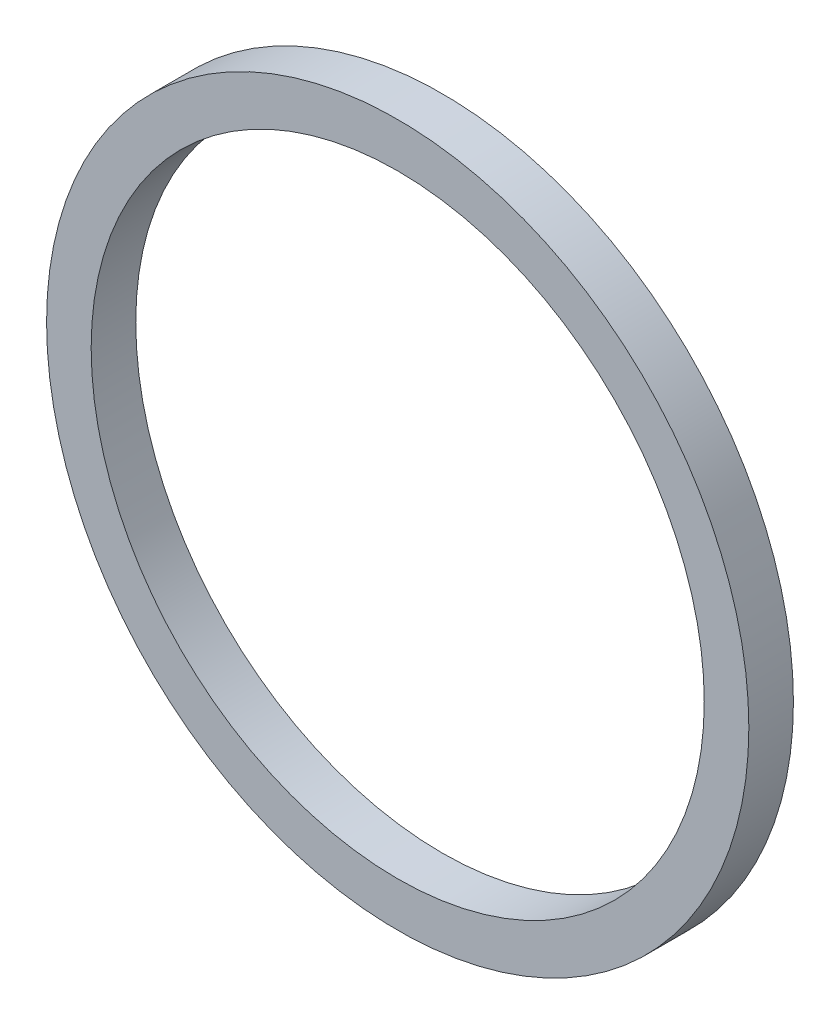
ISO-10303-21;
HEADER;
FILE_DESCRIPTION(('STEP AP214'),'2;1');
FILE_NAME('part.step','',(''),(''),'','','');
FILE_SCHEMA(('AUTOMOTIVE_DESIGN { 1 0 10303 214 1 1 1 1 }'));
ENDSEC;
DATA;
#1=APPLICATION_CONTEXT('core data for automotive mechanical design processes');
#2=APPLICATION_PROTOCOL_DEFINITION('international standard','automotive_design',2000,#1);
#3=PRODUCT_CONTEXT('',#1,'mechanical');
#4=PRODUCT('Part','Part','',(#3));
#5=PRODUCT_RELATED_PRODUCT_CATEGORY('part','',(#4));
#6=PRODUCT_DEFINITION_FORMATION('','',#4);
#7=PRODUCT_DEFINITION_CONTEXT('part definition',#1,'design');
#8=PRODUCT_DEFINITION('design','',#6,#7);
#9=PRODUCT_DEFINITION_SHAPE('','',#8);
#10=(LENGTH_UNIT() NAMED_UNIT(*) SI_UNIT(.MILLI.,.METRE.));
#11=(NAMED_UNIT(*) PLANE_ANGLE_UNIT() SI_UNIT($,.RADIAN.));
#12=(NAMED_UNIT(*) SI_UNIT($,.STERADIAN.) SOLID_ANGLE_UNIT());
#13=UNCERTAINTY_MEASURE_WITH_UNIT(LENGTH_MEASURE(1.E-05),#10,'distance_accuracy_value','');
#14=(GEOMETRIC_REPRESENTATION_CONTEXT(3) GLOBAL_UNCERTAINTY_ASSIGNED_CONTEXT((#13)) GLOBAL_UNIT_ASSIGNED_CONTEXT((#10,
#11,#12)) REPRESENTATION_CONTEXT('',''));
#15=CARTESIAN_POINT('',(0.,0.,0.));
#16=DIRECTION('',(0.,0.,1.));
#17=DIRECTION('',(1.,0.,0.));
#18=AXIS2_PLACEMENT_3D('',#15,#16,#17);
#19=CARTESIAN_POINT('',(0.,0.,8.));
#20=DIRECTION('',(0.,0.,1.));
#21=DIRECTION('',(1.,0.,0.));
#22=AXIS2_PLACEMENT_3D('',#19,#20,#21);
#23=PLANE('',#22);
#24=CARTESIAN_POINT('',(0.,0.,8.));
#25=DIRECTION('',(0.,0.,1.));
#26=DIRECTION('',(1.,0.,0.));
#27=AXIS2_PLACEMENT_3D('',#24,#25,#26);
#28=CIRCLE('',#27,63.);
#29=CARTESIAN_POINT('',(63.,0.,8.));
#30=VERTEX_POINT('',#29);
#31=EDGE_CURVE('E10',#30,#30,#28,.T.);
#32=ORIENTED_EDGE('',*,*,#31,.T.);
#33=EDGE_LOOP('',(#32));
#34=FACE_BOUND('',#33,.T.);
#35=CARTESIAN_POINT('',(0.,0.,8.));
#36=DIRECTION('',(0.,0.,1.));
#37=DIRECTION('',(1.,0.,0.));
#38=AXIS2_PLACEMENT_3D('',#35,#36,#37);
#39=CIRCLE('',#38,55.);
#40=CARTESIAN_POINT('',(55.,0.,8.));
#41=VERTEX_POINT('',#40);
#42=EDGE_CURVE('E46',#41,#41,#39,.T.);
#43=ORIENTED_EDGE('',*,*,#42,.F.);
#44=EDGE_LOOP('',(#43));
#45=FACE_BOUND('',#44,.T.);
#46=ADVANCED_FACE('F35',(#34,#45),#23,.T.);
#47=CARTESIAN_POINT('',(0.,0.,0.));
#48=DIRECTION('',(0.,0.,1.));
#49=DIRECTION('',(1.,0.,0.));
#50=AXIS2_PLACEMENT_3D('',#47,#48,#49);
#51=PLANE('',#50);
#52=CARTESIAN_POINT('',(0.,0.,0.));
#53=DIRECTION('',(0.,0.,1.));
#54=DIRECTION('',(1.,0.,0.));
#55=AXIS2_PLACEMENT_3D('',#52,#53,#54);
#56=CIRCLE('',#55,63.);
#57=CARTESIAN_POINT('',(63.,0.,0.));
#58=VERTEX_POINT('',#57);
#59=EDGE_CURVE('E39',#58,#58,#56,.T.);
#60=ORIENTED_EDGE('',*,*,#59,.F.);
#61=EDGE_LOOP('',(#60));
#62=FACE_BOUND('',#61,.T.);
#63=CARTESIAN_POINT('',(0.,0.,0.));
#64=DIRECTION('',(0.,0.,1.));
#65=DIRECTION('',(1.,0.,0.));
#66=AXIS2_PLACEMENT_3D('',#63,#64,#65);
#67=CIRCLE('',#66,55.);
#68=CARTESIAN_POINT('',(55.,0.,0.));
#69=VERTEX_POINT('',#68);
#70=EDGE_CURVE('E48',#69,#69,#67,.T.);
#71=ORIENTED_EDGE('',*,*,#70,.T.);
#72=EDGE_LOOP('',(#71));
#73=FACE_BOUND('',#72,.T.);
#74=ADVANCED_FACE('F58',(#62,#73),#51,.F.);
#75=CARTESIAN_POINT('',(0.,0.,8.));
#76=DIRECTION('',(0.,0.,-1.));
#77=DIRECTION('',(-1.,0.,0.));
#78=AXIS2_PLACEMENT_3D('',#75,#76,#77);
#79=CYLINDRICAL_SURFACE('',#78,63.);
#80=ORIENTED_EDGE('',*,*,#31,.F.);
#81=EDGE_LOOP('',(#80));
#82=FACE_BOUND('',#81,.T.);
#83=ORIENTED_EDGE('',*,*,#59,.T.);
#84=EDGE_LOOP('',(#83));
#85=FACE_BOUND('',#84,.T.);
#86=ADVANCED_FACE('F37',(#82,#85),#79,.T.);
#87=CARTESIAN_POINT('',(0.,0.,8.));
#88=DIRECTION('',(0.,0.,-1.));
#89=DIRECTION('',(-1.,0.,0.));
#90=AXIS2_PLACEMENT_3D('',#87,#88,#89);
#91=CYLINDRICAL_SURFACE('',#90,55.);
#92=ORIENTED_EDGE('',*,*,#42,.T.);
#93=EDGE_LOOP('',(#92));
#94=FACE_BOUND('',#93,.T.);
#95=ORIENTED_EDGE('',*,*,#70,.F.);
#96=EDGE_LOOP('',(#95));
#97=FACE_BOUND('',#96,.T.);
#98=ADVANCED_FACE('F54',(#94,#97),#91,.F.);
#99=CLOSED_SHELL('',(#46,#74,#86,#98));
#100=MANIFOLD_SOLID_BREP('B2',#99);
#101=ADVANCED_BREP_SHAPE_REPRESENTATION('',(#18,#100),#14);
#102=SHAPE_DEFINITION_REPRESENTATION(#9,#101);
ENDSEC;
END-ISO-10303-21;
